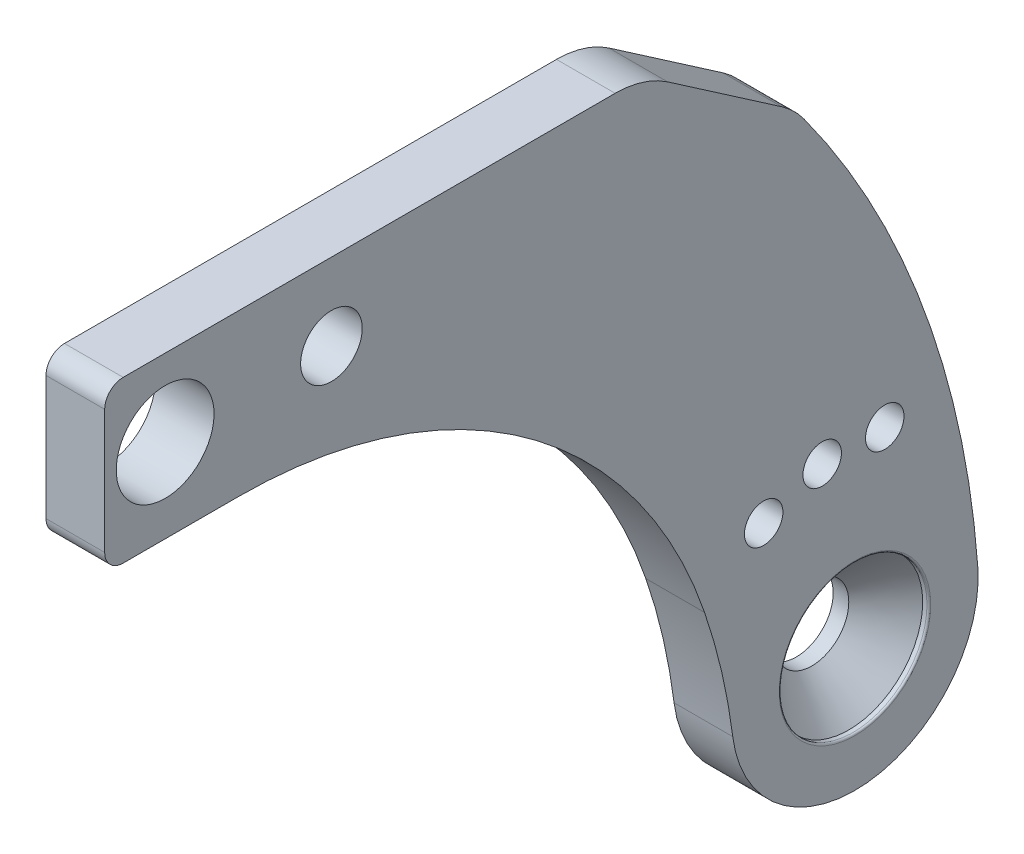
ISO-10303-21;
HEADER;
FILE_DESCRIPTION(('STEP AP214'),'2;1');
FILE_NAME('part.step','',(''),(''),'','','');
FILE_SCHEMA(('AUTOMOTIVE_DESIGN { 1 0 10303 214 1 1 1 1 }'));
ENDSEC;
DATA;
#1=APPLICATION_CONTEXT('core data for automotive mechanical design processes');
#2=APPLICATION_PROTOCOL_DEFINITION('international standard','automotive_design',2000,#1);
#3=PRODUCT_CONTEXT('',#1,'mechanical');
#4=PRODUCT('Part','Part','',(#3));
#5=PRODUCT_RELATED_PRODUCT_CATEGORY('part','',(#4));
#6=PRODUCT_DEFINITION_FORMATION('','',#4);
#7=PRODUCT_DEFINITION_CONTEXT('part definition',#1,'design');
#8=PRODUCT_DEFINITION('design','',#6,#7);
#9=PRODUCT_DEFINITION_SHAPE('','',#8);
#10=(LENGTH_UNIT() NAMED_UNIT(*) SI_UNIT(.MILLI.,.METRE.));
#11=(NAMED_UNIT(*) PLANE_ANGLE_UNIT() SI_UNIT($,.RADIAN.));
#12=(NAMED_UNIT(*) SI_UNIT($,.STERADIAN.) SOLID_ANGLE_UNIT());
#13=UNCERTAINTY_MEASURE_WITH_UNIT(LENGTH_MEASURE(1.E-05),#10,'distance_accuracy_value','');
#14=(GEOMETRIC_REPRESENTATION_CONTEXT(3) GLOBAL_UNCERTAINTY_ASSIGNED_CONTEXT((#13)) GLOBAL_UNIT_ASSIGNED_CONTEXT((#10,
#11,#12)) REPRESENTATION_CONTEXT('',''));
#15=CARTESIAN_POINT('',(0.,0.,0.));
#16=DIRECTION('',(0.,0.,1.));
#17=DIRECTION('',(1.,0.,0.));
#18=AXIS2_PLACEMENT_3D('',#15,#16,#17);
#19=CARTESIAN_POINT('',(4.765,-85.,-112.));
#20=DIRECTION('',(-1.,0.,0.));
#21=DIRECTION('',(0.,0.,1.));
#22=AXIS2_PLACEMENT_3D('',#19,#20,#21);
#23=CYLINDRICAL_SURFACE('',#22,6.);
#24=CARTESIAN_POINT('',(-4.765,-85.,-112.));
#25=DIRECTION('',(1.,0.,0.));
#26=DIRECTION('',(0.,0.,-1.));
#27=AXIS2_PLACEMENT_3D('',#24,#25,#26);
#28=CIRCLE('',#27,6.);
#29=CARTESIAN_POINT('',(-4.765,-85.,-118.));
#30=VERTEX_POINT('',#29);
#31=EDGE_CURVE('E154',#30,#30,#28,.T.);
#32=ORIENTED_EDGE('',*,*,#31,.F.);
#33=EDGE_LOOP('',(#32));
#34=FACE_BOUND('',#33,.T.);
#35=CARTESIAN_POINT('',(-2.23499999999997,-85.,-112.));
#36=DIRECTION('',(1.,0.,0.));
#37=DIRECTION('',(0.,0.,-1.));
#38=AXIS2_PLACEMENT_3D('',#35,#36,#37);
#39=CIRCLE('',#38,6.);
#40=CARTESIAN_POINT('',(-2.23499999999997,-85.,-118.));
#41=VERTEX_POINT('',#40);
#42=EDGE_CURVE('E170',#41,#41,#39,.T.);
#43=ORIENTED_EDGE('',*,*,#42,.T.);
#44=EDGE_LOOP('',(#43));
#45=FACE_BOUND('',#44,.T.);
#46=ADVANCED_FACE('F39',(#34,#45),#23,.F.);
#47=CARTESIAN_POINT('',(4.765,-85.,-112.));
#48=DIRECTION('',(-1.,0.,0.));
#49=DIRECTION('',(0.,0.,1.));
#50=AXIS2_PLACEMENT_3D('',#47,#48,#49);
#51=CYLINDRICAL_SURFACE('',#50,20.);
#52=CARTESIAN_POINT('',(-4.765,-85.,-112.));
#53=DIRECTION('',(1.,0.,0.));
#54=DIRECTION('',(0.,0.,-1.));
#55=AXIS2_PLACEMENT_3D('',#52,#53,#54);
#56=CIRCLE('',#55,20.);
#57=CARTESIAN_POINT('',(-4.765,-87.5158770823754,-92.158871944711));
#58=VERTEX_POINT('',#57);
#59=CARTESIAN_POINT('',(-4.765,-83.5261443022049,-131.94561980441));
#60=VERTEX_POINT('',#59);
#61=EDGE_CURVE('E158',#58,#60,#56,.T.);
#62=ORIENTED_EDGE('',*,*,#61,.T.);
#63=DIRECTION('',(-1.,0.,0.));
#64=VECTOR('',#63,1.);
#65=CARTESIAN_POINT('',(4.765,-83.5261443022049,-131.94561980441));
#66=LINE('',#65,#64);
#67=CARTESIAN_POINT('',(4.765,-83.5261443022049,-131.94561980441));
#68=VERTEX_POINT('',#67);
#69=EDGE_CURVE('E136',#68,#60,#66,.T.);
#70=ORIENTED_EDGE('',*,*,#69,.F.);
#71=CARTESIAN_POINT('',(4.765,-85.,-112.));
#72=DIRECTION('',(1.,0.,0.));
#73=DIRECTION('',(0.,0.,-1.));
#74=AXIS2_PLACEMENT_3D('',#71,#72,#73);
#75=CIRCLE('',#74,20.);
#76=CARTESIAN_POINT('',(4.765,-87.5158770823754,-92.158871944711));
#77=VERTEX_POINT('',#76);
#78=EDGE_CURVE('E143',#77,#68,#75,.T.);
#79=ORIENTED_EDGE('',*,*,#78,.F.);
#80=DIRECTION('',(-1.,0.,0.));
#81=VECTOR('',#80,1.);
#82=CARTESIAN_POINT('',(4.765,-87.5158770823754,-92.158871944711));
#83=LINE('',#82,#81);
#84=EDGE_CURVE('E236',#77,#58,#83,.T.);
#85=ORIENTED_EDGE('',*,*,#84,.T.);
#86=EDGE_LOOP('',(#62,#70,#79,#85));
#87=FACE_BOUND('',#86,.T.);
#88=ADVANCED_FACE('F156',(#87),#51,.T.);
#89=CARTESIAN_POINT('',(4.765,-94.5800620356681,17.6465287286657));
#90=DIRECTION('',(-1.,0.,0.));
#91=DIRECTION('',(0.,0.,1.));
#92=AXIS2_PLACEMENT_3D('',#89,#90,#91);
#93=CYLINDRICAL_SURFACE('',#92,150.);
#94=CARTESIAN_POINT('',(-4.765,-94.5800620356681,17.6465287286657));
#95=DIRECTION('',(1.,0.,0.));
#96=DIRECTION('',(0.,0.,-1.));
#97=AXIS2_PLACEMENT_3D('',#94,#95,#96);
#98=CIRCLE('',#97,150.);
#99=CARTESIAN_POINT('',(-4.765,-6.44798641080063,-103.731958846574));
#100=VERTEX_POINT('',#99);
#101=EDGE_CURVE('E238',#60,#100,#98,.T.);
#102=ORIENTED_EDGE('',*,*,#101,.T.);
#103=DIRECTION('',(-1.,0.,0.));
#104=VECTOR('',#103,1.);
#105=CARTESIAN_POINT('',(4.765,-6.44798641080062,-103.731958846574));
#106=LINE('',#105,#104);
#107=CARTESIAN_POINT('',(4.765,-6.44798641080063,-103.731958846574));
#108=VERTEX_POINT('',#107);
#109=EDGE_CURVE('E139',#100,#108,#106,.F.);
#110=ORIENTED_EDGE('',*,*,#109,.T.);
#111=CARTESIAN_POINT('',(4.765,-94.5800620356681,17.6465287286657));
#112=DIRECTION('',(1.,0.,0.));
#113=DIRECTION('',(0.,0.,-1.));
#114=AXIS2_PLACEMENT_3D('',#111,#112,#113);
#115=CIRCLE('',#114,150.);
#116=EDGE_CURVE('E131',#68,#108,#115,.T.);
#117=ORIENTED_EDGE('',*,*,#116,.F.);
#118=ORIENTED_EDGE('',*,*,#69,.T.);
#119=EDGE_LOOP('',(#102,#110,#117,#118));
#120=FACE_BOUND('',#119,.T.);
#121=ADVANCED_FACE('F134',(#120),#93,.T.);
#122=CARTESIAN_POINT('',(4.765,44.790257494992,-30.8491384775337));
#123=DIRECTION('',(0.,-0.823562335253105,0.56722577511292));
#124=DIRECTION('',(0.,-0.56722577511292,-0.823562335253105));
#125=AXIS2_PLACEMENT_3D('',#122,#123,#124);
#126=PLANE('',#125);
#127=DIRECTION('',(0.,0.56722577511292,0.823562335253105));
#128=VECTOR('',#127,1.);
#129=CARTESIAN_POINT('',(4.765,44.790257494992,-30.8491384775337));
#130=LINE('',#129,#128);
#131=CARTESIAN_POINT('',(4.765,-2.90775894449084,-100.102496715744));
#132=VERTEX_POINT('',#131);
#133=CARTESIAN_POINT('',(4.765,9.85343502879504,-81.574356475352));
#134=VERTEX_POINT('',#133);
#135=EDGE_CURVE('E142',#132,#134,#130,.T.);
#136=ORIENTED_EDGE('',*,*,#135,.F.);
#137=DIRECTION('',(-1.,0.,0.));
#138=VECTOR('',#137,1.);
#139=CARTESIAN_POINT('',(4.765,-2.90775894449084,-100.102496715744));
#140=LINE('',#139,#138);
#141=CARTESIAN_POINT('',(-4.765,-2.90775894449084,-100.102496715744));
#142=VERTEX_POINT('',#141);
#143=EDGE_CURVE('E187',#132,#142,#140,.T.);
#144=ORIENTED_EDGE('',*,*,#143,.T.);
#145=DIRECTION('',(0.,0.56722577511292,0.823562335253105));
#146=VECTOR('',#145,1.);
#147=CARTESIAN_POINT('',(-4.765,44.790257494992,-30.8491384775337));
#148=LINE('',#147,#146);
#149=CARTESIAN_POINT('',(-4.765,9.85343502879504,-81.574356475352));
#150=VERTEX_POINT('',#149);
#151=EDGE_CURVE('E240',#142,#150,#148,.T.);
#152=ORIENTED_EDGE('',*,*,#151,.T.);
#153=DIRECTION('',(-1.,0.,0.));
#154=VECTOR('',#153,1.);
#155=CARTESIAN_POINT('',(4.765,9.85343502879504,-81.574356475352));
#156=LINE('',#155,#154);
#157=EDGE_CURVE('E160',#134,#150,#156,.T.);
#158=ORIENTED_EDGE('',*,*,#157,.F.);
#159=EDGE_LOOP('',(#136,#144,#152,#158));
#160=FACE_BOUND('',#159,.T.);
#161=ADVANCED_FACE('F268',(#160),#126,.F.);
#162=CARTESIAN_POINT('',(4.765,-2.5000000000015,-73.0659698486582));
#163=DIRECTION('',(-1.,0.,0.));
#164=DIRECTION('',(0.,0.,1.));
#165=AXIS2_PLACEMENT_3D('',#162,#163,#164);
#166=CYLINDRICAL_SURFACE('',#165,15.);
#167=CARTESIAN_POINT('',(-4.765,-2.5000000000015,-73.0659698486582));
#168=DIRECTION('',(1.,0.,0.));
#169=DIRECTION('',(0.,0.,-1.));
#170=AXIS2_PLACEMENT_3D('',#167,#168,#169);
#171=CIRCLE('',#170,15.);
#172=CARTESIAN_POINT('',(-4.765,12.4999999999985,-73.0659698486582));
#173=VERTEX_POINT('',#172);
#174=EDGE_CURVE('E242',#150,#173,#171,.T.);
#175=ORIENTED_EDGE('',*,*,#174,.T.);
#176=DIRECTION('',(-1.,0.,0.));
#177=VECTOR('',#176,1.);
#178=CARTESIAN_POINT('',(4.765,12.4999999999985,-73.0659698486582));
#179=LINE('',#178,#177);
#180=CARTESIAN_POINT('',(4.765,12.4999999999985,-73.0659698486582));
#181=VERTEX_POINT('',#180);
#182=EDGE_CURVE('E166',#181,#173,#179,.T.);
#183=ORIENTED_EDGE('',*,*,#182,.F.);
#184=CARTESIAN_POINT('',(4.765,-2.5000000000015,-73.0659698486582));
#185=DIRECTION('',(1.,0.,0.));
#186=DIRECTION('',(0.,0.,-1.));
#187=AXIS2_PLACEMENT_3D('',#184,#185,#186);
#188=CIRCLE('',#187,15.);
#189=EDGE_CURVE('E230',#134,#181,#188,.T.);
#190=ORIENTED_EDGE('',*,*,#189,.F.);
#191=ORIENTED_EDGE('',*,*,#157,.T.);
#192=EDGE_LOOP('',(#175,#183,#190,#191));
#193=FACE_BOUND('',#192,.T.);
#194=ADVANCED_FACE('F264',(#193),#166,.T.);
#195=CARTESIAN_POINT('',(4.765,12.4999999999985,0.));
#196=DIRECTION('',(0.,-1.,0.));
#197=DIRECTION('',(0.,0.,-1.));
#198=AXIS2_PLACEMENT_3D('',#195,#196,#197);
#199=PLANE('',#198);
#200=DIRECTION('',(0.,0.,1.));
#201=VECTOR('',#200,1.);
#202=CARTESIAN_POINT('',(-4.765,12.4999999999985,0.));
#203=LINE('',#202,#201);
#204=CARTESIAN_POINT('',(-4.765,12.4999999999985,6.81645687003658));
#205=VERTEX_POINT('',#204);
#206=EDGE_CURVE('E244',#173,#205,#203,.T.);
#207=ORIENTED_EDGE('',*,*,#206,.T.);
#208=DIRECTION('',(1.,0.,0.));
#209=VECTOR('',#208,1.);
#210=CARTESIAN_POINT('',(4.765,12.4999999999985,6.81645687003658));
#211=LINE('',#210,#209);
#212=CARTESIAN_POINT('',(4.765,12.4999999999985,6.81645687003658));
#213=VERTEX_POINT('',#212);
#214=EDGE_CURVE('E11',#205,#213,#211,.T.);
#215=ORIENTED_EDGE('',*,*,#214,.T.);
#216=DIRECTION('',(0.,0.,1.));
#217=VECTOR('',#216,1.);
#218=CARTESIAN_POINT('',(4.765,12.4999999999985,0.));
#219=LINE('',#218,#217);
#220=EDGE_CURVE('E225',#181,#213,#219,.T.);
#221=ORIENTED_EDGE('',*,*,#220,.F.);
#222=ORIENTED_EDGE('',*,*,#182,.T.);
#223=EDGE_LOOP('',(#207,#215,#221,#222));
#224=FACE_BOUND('',#223,.T.);
#225=ADVANCED_FACE('F258',(#224),#199,.F.);
#226=CARTESIAN_POINT('',(4.765,-13.626101457147,0.));
#227=DIRECTION('',(0.,1.,0.));
#228=DIRECTION('',(0.,0.,1.));
#229=AXIS2_PLACEMENT_3D('',#226,#227,#228);
#230=PLANE('',#229);
#231=DIRECTION('',(0.,0.,-1.));
#232=VECTOR('',#231,1.);
#233=CARTESIAN_POINT('',(4.765,-13.626101457147,0.));
#234=LINE('',#233,#232);
#235=CARTESIAN_POINT('',(4.765,-13.626101457147,6.81645687003658));
#236=VERTEX_POINT('',#235);
#237=CARTESIAN_POINT('',(4.765,-13.626101457147,-11.8780818783994));
#238=VERTEX_POINT('',#237);
#239=EDGE_CURVE('E221',#236,#238,#234,.T.);
#240=ORIENTED_EDGE('',*,*,#239,.F.);
#241=DIRECTION('',(1.,0.,0.));
#242=VECTOR('',#241,1.);
#243=CARTESIAN_POINT('',(4.765,-13.626101457147,6.81645687003658));
#244=LINE('',#243,#242);
#245=CARTESIAN_POINT('',(-4.765,-13.626101457147,6.81645687003658));
#246=VERTEX_POINT('',#245);
#247=EDGE_CURVE('E62',#236,#246,#244,.F.);
#248=ORIENTED_EDGE('',*,*,#247,.T.);
#249=DIRECTION('',(0.,0.,-1.));
#250=VECTOR('',#249,1.);
#251=CARTESIAN_POINT('',(-4.765,-13.626101457147,0.));
#252=LINE('',#251,#250);
#253=CARTESIAN_POINT('',(-4.765,-13.626101457147,-11.8780818783994));
#254=VERTEX_POINT('',#253);
#255=EDGE_CURVE('E210',#246,#254,#252,.T.);
#256=ORIENTED_EDGE('',*,*,#255,.T.);
#257=DIRECTION('',(1.,0.,0.));
#258=VECTOR('',#257,1.);
#259=CARTESIAN_POINT('',(4.765,-13.626101457147,-11.8780818783994));
#260=LINE('',#259,#258);
#261=EDGE_CURVE('E179',#254,#238,#260,.T.);
#262=ORIENTED_EDGE('',*,*,#261,.T.);
#263=EDGE_LOOP('',(#240,#248,#256,#262));
#264=FACE_BOUND('',#263,.T.);
#265=ADVANCED_FACE('F222',(#264),#230,.F.);
#266=CARTESIAN_POINT('',(4.765,-1.94289029309402E-13,-27.));
#267=DIRECTION('',(-1.,0.,0.));
#268=DIRECTION('',(0.,0.,1.));
#269=AXIS2_PLACEMENT_3D('',#266,#267,#268);
#270=CYLINDRICAL_SURFACE('',#269,4.99999999999999);
#271=CARTESIAN_POINT('',(4.765,-1.94289029309402E-13,-27.));
#272=DIRECTION('',(1.,0.,0.));
#273=DIRECTION('',(0.,0.,-1.));
#274=AXIS2_PLACEMENT_3D('',#271,#272,#273);
#275=CIRCLE('',#274,4.99999999999999);
#276=CARTESIAN_POINT('',(4.765,-1.94289029309402E-13,-32.));
#277=VERTEX_POINT('',#276);
#278=EDGE_CURVE('E227',#277,#277,#275,.T.);
#279=ORIENTED_EDGE('',*,*,#278,.T.);
#280=EDGE_LOOP('',(#279));
#281=FACE_BOUND('',#280,.T.);
#282=CARTESIAN_POINT('',(-4.765,-1.94289029309402E-13,-27.));
#283=DIRECTION('',(1.,0.,0.));
#284=DIRECTION('',(0.,0.,-1.));
#285=AXIS2_PLACEMENT_3D('',#282,#283,#284);
#286=CIRCLE('',#285,4.99999999999999);
#287=CARTESIAN_POINT('',(-4.765,-1.94289029309402E-13,-32.));
#288=VERTEX_POINT('',#287);
#289=EDGE_CURVE('E249',#288,#288,#286,.T.);
#290=ORIENTED_EDGE('',*,*,#289,.F.);
#291=EDGE_LOOP('',(#290));
#292=FACE_BOUND('',#291,.T.);
#293=ADVANCED_FACE('F302',(#281,#292),#270,.F.);
#294=CARTESIAN_POINT('',(4.765,-100.095262494252,7.04676833173432));
#295=DIRECTION('',(-1.,0.,0.));
#296=DIRECTION('',(0.,0.,1.));
#297=AXIS2_PLACEMENT_3D('',#294,#295,#296);
#298=CYLINDRICAL_SURFACE('',#297,100.);
#299=CARTESIAN_POINT('',(4.765,-100.095262494252,7.04676833173432));
#300=DIRECTION('',(1.,0.,0.));
#301=DIRECTION('',(0.,0.,-1.));
#302=AXIS2_PLACEMENT_3D('',#299,#300,#301);
#303=CIRCLE('',#302,100.);
#304=CARTESIAN_POINT('',(4.765,-67.7494573087261,-87.5774827189344));
#305=VERTEX_POINT('',#304);
#306=EDGE_CURVE('E150',#305,#77,#303,.F.);
#307=ORIENTED_EDGE('',*,*,#306,.F.);
#308=DIRECTION('',(-1.,0.,0.));
#309=VECTOR('',#308,1.);
#310=CARTESIAN_POINT('',(4.765,-67.7494573087261,-87.5774827189344));
#311=LINE('',#310,#309);
#312=CARTESIAN_POINT('',(-4.765,-67.7494573087261,-87.5774827189344));
#313=VERTEX_POINT('',#312);
#314=EDGE_CURVE('E176',#305,#313,#311,.T.);
#315=ORIENTED_EDGE('',*,*,#314,.T.);
#316=CARTESIAN_POINT('',(-4.765,-100.095262494252,7.04676833173432));
#317=DIRECTION('',(1.,0.,0.));
#318=DIRECTION('',(0.,0.,-1.));
#319=AXIS2_PLACEMENT_3D('',#316,#317,#318);
#320=CIRCLE('',#319,100.);
#321=EDGE_CURVE('E247',#313,#58,#320,.F.);
#322=ORIENTED_EDGE('',*,*,#321,.T.);
#323=ORIENTED_EDGE('',*,*,#84,.F.);
#324=EDGE_LOOP('',(#307,#315,#322,#323));
#325=FACE_BOUND('',#324,.T.);
#326=ADVANCED_FACE('F274',(#325),#298,.F.);
#327=CARTESIAN_POINT('',(4.765,0.,0.));
#328=DIRECTION('',(1.,0.,0.));
#329=DIRECTION('',(0.,0.,-1.));
#330=AXIS2_PLACEMENT_3D('',#327,#328,#329);
#331=PLANE('',#330);
#332=CARTESIAN_POINT('',(4.765,0.,0.));
#333=DIRECTION('',(1.,0.,0.));
#334=DIRECTION('',(0.,0.,-1.));
#335=AXIS2_PLACEMENT_3D('',#332,#333,#334);
#336=CIRCLE('',#335,7.94);
#337=CARTESIAN_POINT('',(4.765,0.,-7.94));
#338=VERTEX_POINT('',#337);
#339=EDGE_CURVE('E438',#338,#338,#336,.T.);
#340=ORIENTED_EDGE('',*,*,#339,.F.);
#341=EDGE_LOOP('',(#340));
#342=FACE_BOUND('',#341,.T.);
#343=DIRECTION('',(0.,1.,0.));
#344=VECTOR('',#343,1.);
#345=CARTESIAN_POINT('',(4.765,12.4999999999985,9.81645687003658));
#346=LINE('',#345,#344);
#347=CARTESIAN_POINT('',(4.765,-10.626101457147,9.81645687003658));
#348=VERTEX_POINT('',#347);
#349=CARTESIAN_POINT('',(4.765,9.49999999999848,9.81645687003658));
#350=VERTEX_POINT('',#349);
#351=EDGE_CURVE('E218',#348,#350,#346,.T.);
#352=ORIENTED_EDGE('',*,*,#351,.F.);
#353=CARTESIAN_POINT('',(4.765,-10.626101457147,6.81645687003658));
#354=DIRECTION('',(1.,0.,0.));
#355=DIRECTION('',(0.,0.,-1.));
#356=AXIS2_PLACEMENT_3D('',#353,#354,#355);
#357=CIRCLE('',#356,3.);
#358=EDGE_CURVE('E202',#348,#236,#357,.T.);
#359=ORIENTED_EDGE('',*,*,#358,.T.);
#360=ORIENTED_EDGE('',*,*,#239,.T.);
#361=CARTESIAN_POINT('',(4.765,-93.626101457147,-11.8780818783994));
#362=DIRECTION('',(1.,0.,0.));
#363=DIRECTION('',(0.,0.,-1.));
#364=AXIS2_PLACEMENT_3D('',#361,#362,#363);
#365=CIRCLE('',#364,80.);
#366=EDGE_CURVE('E185',#238,#305,#365,.F.);
#367=ORIENTED_EDGE('',*,*,#366,.T.);
#368=ORIENTED_EDGE('',*,*,#306,.T.);
#369=ORIENTED_EDGE('',*,*,#78,.T.);
#370=ORIENTED_EDGE('',*,*,#116,.T.);
#371=CARTESIAN_POINT('',(4.765,-15.2611939732874,-91.5941100890501));
#372=DIRECTION('',(1.,0.,0.));
#373=DIRECTION('',(0.,0.,-1.));
#374=AXIS2_PLACEMENT_3D('',#371,#372,#373);
#375=CIRCLE('',#374,15.);
#376=EDGE_CURVE('E193',#108,#132,#375,.T.);
#377=ORIENTED_EDGE('',*,*,#376,.T.);
#378=ORIENTED_EDGE('',*,*,#135,.T.);
#379=ORIENTED_EDGE('',*,*,#189,.T.);
#380=ORIENTED_EDGE('',*,*,#220,.T.);
#381=CARTESIAN_POINT('',(4.765,9.49999999999848,6.81645687003658));
#382=DIRECTION('',(1.,0.,0.));
#383=DIRECTION('',(0.,0.,-1.));
#384=AXIS2_PLACEMENT_3D('',#381,#382,#383);
#385=CIRCLE('',#384,3.);
#386=EDGE_CURVE('E200',#213,#350,#385,.T.);
#387=ORIENTED_EDGE('',*,*,#386,.T.);
#388=EDGE_LOOP('',(#352,#359,#360,#367,#368,#369,#370,#377,#378,#379,#380,#387));
#389=FACE_BOUND('',#388,.T.);
#390=CARTESIAN_POINT('',(4.765,-60.,-97.1752158531735));
#391=DIRECTION('',(1.,0.,0.));
#392=DIRECTION('',(0.,0.,-1.));
#393=AXIS2_PLACEMENT_3D('',#390,#391,#392);
#394=CIRCLE('',#393,3.125);
#395=CARTESIAN_POINT('',(4.765,-60.,-100.300215853173));
#396=VERTEX_POINT('',#395);
#397=EDGE_CURVE('E446',#396,#396,#394,.F.);
#398=ORIENTED_EDGE('',*,*,#397,.T.);
#399=EDGE_LOOP('',(#398));
#400=FACE_BOUND('',#399,.T.);
#401=CARTESIAN_POINT('',(4.765,-56.3404058236579,-116.837549653221));
#402=DIRECTION('',(1.,0.,0.));
#403=DIRECTION('',(0.,0.,-1.));
#404=AXIS2_PLACEMENT_3D('',#401,#402,#403);
#405=CIRCLE('',#404,3.125);
#406=CARTESIAN_POINT('',(4.765,-56.3404058236579,-119.962549653221));
#407=VERTEX_POINT('',#406);
#408=EDGE_CURVE('E452',#407,#407,#405,.F.);
#409=ORIENTED_EDGE('',*,*,#408,.T.);
#410=EDGE_LOOP('',(#409));
#411=FACE_BOUND('',#410,.T.);
#412=CARTESIAN_POINT('',(4.765,-56.4257134050813,-106.681694763231));
#413=DIRECTION('',(1.,0.,0.));
#414=DIRECTION('',(0.,0.,-1.));
#415=AXIS2_PLACEMENT_3D('',#412,#413,#414);
#416=CIRCLE('',#415,3.125);
#417=CARTESIAN_POINT('',(4.765,-56.4257134050813,-109.806694763231));
#418=VERTEX_POINT('',#417);
#419=EDGE_CURVE('E217',#418,#418,#416,.F.);
#420=ORIENTED_EDGE('',*,*,#419,.T.);
#421=EDGE_LOOP('',(#420));
#422=FACE_BOUND('',#421,.T.);
#423=CARTESIAN_POINT('',(4.765,-85.,-112.));
#424=DIRECTION('',(1.,0.,0.));
#425=DIRECTION('',(0.,0.,-1.));
#426=AXIS2_PLACEMENT_3D('',#423,#424,#425);
#427=CIRCLE('',#426,12.3);
#428=CARTESIAN_POINT('',(4.765,-85.,-124.3));
#429=VERTEX_POINT('',#428);
#430=EDGE_CURVE('E163',#429,#429,#427,.F.);
#431=ORIENTED_EDGE('',*,*,#430,.T.);
#432=EDGE_LOOP('',(#431));
#433=FACE_BOUND('',#432,.T.);
#434=ORIENTED_EDGE('',*,*,#278,.F.);
#435=EDGE_LOOP('',(#434));
#436=FACE_BOUND('',#435,.T.);
#437=ADVANCED_FACE('F147',(#342,#389,#400,#411,#422,#433,#436),#331,.T.);
#438=CARTESIAN_POINT('',(-4.765,0.,0.));
#439=DIRECTION('',(1.,0.,0.));
#440=DIRECTION('',(0.,0.,-1.));
#441=AXIS2_PLACEMENT_3D('',#438,#439,#440);
#442=PLANE('',#441);
#443=CARTESIAN_POINT('',(-4.765,0.,0.));
#444=DIRECTION('',(1.,0.,0.));
#445=DIRECTION('',(0.,0.,-1.));
#446=AXIS2_PLACEMENT_3D('',#443,#444,#445);
#447=CIRCLE('',#446,7.94);
#448=CARTESIAN_POINT('',(-4.765,0.,-7.94));
#449=VERTEX_POINT('',#448);
#450=EDGE_CURVE('E435',#449,#449,#447,.T.);
#451=ORIENTED_EDGE('',*,*,#450,.T.);
#452=EDGE_LOOP('',(#451));
#453=FACE_BOUND('',#452,.T.);
#454=CARTESIAN_POINT('',(-4.765,-60.,-97.1752158531735));
#455=DIRECTION('',(-1.,0.,0.));
#456=DIRECTION('',(0.,0.,1.));
#457=AXIS2_PLACEMENT_3D('',#454,#455,#456);
#458=CIRCLE('',#457,3.125);
#459=CARTESIAN_POINT('',(-4.765,-60.,-94.0502158531735));
#460=VERTEX_POINT('',#459);
#461=EDGE_CURVE('E443',#460,#460,#458,.T.);
#462=ORIENTED_EDGE('',*,*,#461,.F.);
#463=EDGE_LOOP('',(#462));
#464=FACE_BOUND('',#463,.T.);
#465=CARTESIAN_POINT('',(-4.765,-56.3404058236579,-116.837549653221));
#466=DIRECTION('',(-1.,0.,0.));
#467=DIRECTION('',(0.,0.,1.));
#468=AXIS2_PLACEMENT_3D('',#465,#466,#467);
#469=CIRCLE('',#468,3.125);
#470=CARTESIAN_POINT('',(-4.765,-56.3404058236579,-113.712549653221));
#471=VERTEX_POINT('',#470);
#472=EDGE_CURVE('E449',#471,#471,#469,.T.);
#473=ORIENTED_EDGE('',*,*,#472,.F.);
#474=EDGE_LOOP('',(#473));
#475=FACE_BOUND('',#474,.T.);
#476=CARTESIAN_POINT('',(-4.765,-56.4257134050813,-106.681694763231));
#477=DIRECTION('',(-1.,0.,0.));
#478=DIRECTION('',(0.,0.,1.));
#479=AXIS2_PLACEMENT_3D('',#476,#477,#478);
#480=CIRCLE('',#479,3.125);
#481=CARTESIAN_POINT('',(-4.765,-56.4257134050813,-103.556694763231));
#482=VERTEX_POINT('',#481);
#483=EDGE_CURVE('E455',#482,#482,#480,.T.);
#484=ORIENTED_EDGE('',*,*,#483,.F.);
#485=EDGE_LOOP('',(#484));
#486=FACE_BOUND('',#485,.T.);
#487=ORIENTED_EDGE('',*,*,#255,.F.);
#488=CARTESIAN_POINT('',(-4.765,-10.626101457147,6.81645687003658));
#489=DIRECTION('',(1.,0.,0.));
#490=DIRECTION('',(0.,0.,-1.));
#491=AXIS2_PLACEMENT_3D('',#488,#489,#490);
#492=CIRCLE('',#491,3.);
#493=CARTESIAN_POINT('',(-4.765,-10.626101457147,9.81645687003658));
#494=VERTEX_POINT('',#493);
#495=EDGE_CURVE('E47',#246,#494,#492,.F.);
#496=ORIENTED_EDGE('',*,*,#495,.T.);
#497=DIRECTION('',(0.,1.,0.));
#498=VECTOR('',#497,1.);
#499=CARTESIAN_POINT('',(-4.765,12.4999999999985,9.81645687003658));
#500=LINE('',#499,#498);
#501=CARTESIAN_POINT('',(-4.765,9.49999999999848,9.81645687003658));
#502=VERTEX_POINT('',#501);
#503=EDGE_CURVE('E209',#494,#502,#500,.T.);
#504=ORIENTED_EDGE('',*,*,#503,.T.);
#505=CARTESIAN_POINT('',(-4.765,9.49999999999848,6.81645687003658));
#506=DIRECTION('',(1.,0.,0.));
#507=DIRECTION('',(0.,0.,-1.));
#508=AXIS2_PLACEMENT_3D('',#505,#506,#507);
#509=CIRCLE('',#508,3.);
#510=EDGE_CURVE('E54',#502,#205,#509,.F.);
#511=ORIENTED_EDGE('',*,*,#510,.T.);
#512=ORIENTED_EDGE('',*,*,#206,.F.);
#513=ORIENTED_EDGE('',*,*,#174,.F.);
#514=ORIENTED_EDGE('',*,*,#151,.F.);
#515=CARTESIAN_POINT('',(-4.765,-15.2611939732874,-91.5941100890501));
#516=DIRECTION('',(1.,0.,0.));
#517=DIRECTION('',(0.,0.,-1.));
#518=AXIS2_PLACEMENT_3D('',#515,#516,#517);
#519=CIRCLE('',#518,15.);
#520=EDGE_CURVE('E190',#142,#100,#519,.F.);
#521=ORIENTED_EDGE('',*,*,#520,.T.);
#522=ORIENTED_EDGE('',*,*,#101,.F.);
#523=ORIENTED_EDGE('',*,*,#61,.F.);
#524=ORIENTED_EDGE('',*,*,#321,.F.);
#525=CARTESIAN_POINT('',(-4.765,-93.626101457147,-11.8780818783994));
#526=DIRECTION('',(1.,0.,0.));
#527=DIRECTION('',(0.,0.,-1.));
#528=AXIS2_PLACEMENT_3D('',#525,#526,#527);
#529=CIRCLE('',#528,80.);
#530=EDGE_CURVE('E182',#313,#254,#529,.T.);
#531=ORIENTED_EDGE('',*,*,#530,.T.);
#532=EDGE_LOOP('',(#487,#496,#504,#511,#512,#513,#514,#521,#522,#523,#524,#531));
#533=FACE_BOUND('',#532,.T.);
#534=ORIENTED_EDGE('',*,*,#289,.T.);
#535=EDGE_LOOP('',(#534));
#536=FACE_BOUND('',#535,.T.);
#537=ORIENTED_EDGE('',*,*,#31,.T.);
#538=EDGE_LOOP('',(#537));
#539=FACE_BOUND('',#538,.T.);
#540=ADVANCED_FACE('F207',(#453,#464,#475,#486,#533,#536,#539),#442,.F.);
#541=CARTESIAN_POINT('',(4.765,-85.,-112.));
#542=DIRECTION('',(1.,0.,0.));
#543=DIRECTION('',(0.,0.,-1.));
#544=AXIS2_PLACEMENT_3D('',#541,#542,#543);
#545=CYLINDRICAL_SURFACE('',#544,12.);
#546=CARTESIAN_POINT('',(4.465,-85.,-112.));
#547=DIRECTION('',(1.,0.,0.));
#548=DIRECTION('',(0.,0.,-1.));
#549=AXIS2_PLACEMENT_3D('',#546,#547,#548);
#550=CIRCLE('',#549,12.);
#551=CARTESIAN_POINT('',(4.465,-85.,-124.));
#552=VERTEX_POINT('',#551);
#553=EDGE_CURVE('E159',#552,#552,#550,.T.);
#554=ORIENTED_EDGE('',*,*,#553,.T.);
#555=EDGE_LOOP('',(#554));
#556=FACE_BOUND('',#555,.T.);
#557=CARTESIAN_POINT('',(3.765,-85.,-112.));
#558=DIRECTION('',(1.,0.,0.));
#559=DIRECTION('',(0.,0.,-1.));
#560=AXIS2_PLACEMENT_3D('',#557,#558,#559);
#561=CIRCLE('',#560,12.);
#562=CARTESIAN_POINT('',(3.765,-85.,-124.));
#563=VERTEX_POINT('',#562);
#564=EDGE_CURVE('E172',#563,#563,#561,.T.);
#565=ORIENTED_EDGE('',*,*,#564,.F.);
#566=EDGE_LOOP('',(#565));
#567=FACE_BOUND('',#566,.T.);
#568=ADVANCED_FACE('F357',(#556,#567),#545,.F.);
#569=CARTESIAN_POINT('',(-2.24499999999998,-85.,-112.));
#570=DIRECTION('',(1.,0.,0.));
#571=DIRECTION('',(0.,0.,-1.));
#572=AXIS2_PLACEMENT_3D('',#569,#570,#571);
#573=CONICAL_SURFACE('',#572,5.98999999999999,0.78539816339745);
#574=ORIENTED_EDGE('',*,*,#42,.F.);
#575=EDGE_LOOP('',(#574));
#576=FACE_BOUND('',#575,.T.);
#577=ORIENTED_EDGE('',*,*,#564,.T.);
#578=EDGE_LOOP('',(#577));
#579=FACE_BOUND('',#578,.T.);
#580=ADVANCED_FACE('F287',(#576,#579),#573,.F.);
#581=CARTESIAN_POINT('',(4.465,-85.,-112.));
#582=DIRECTION('',(1.,0.,0.));
#583=DIRECTION('',(0.,0.,-1.));
#584=AXIS2_PLACEMENT_3D('',#581,#582,#583);
#585=TOROIDAL_SURFACE('',#584,12.3,0.3);
#586=ORIENTED_EDGE('',*,*,#430,.F.);
#587=EDGE_LOOP('',(#586));
#588=FACE_BOUND('',#587,.T.);
#589=ORIENTED_EDGE('',*,*,#553,.F.);
#590=EDGE_LOOP('',(#589));
#591=FACE_BOUND('',#590,.T.);
#592=ADVANCED_FACE('F279',(#588,#591),#585,.T.);
#593=CARTESIAN_POINT('',(4.765,-93.626101457147,-11.8780818783994));
#594=DIRECTION('',(-1.,0.,0.));
#595=DIRECTION('',(0.,0.,1.));
#596=AXIS2_PLACEMENT_3D('',#593,#594,#595);
#597=CYLINDRICAL_SURFACE('',#596,80.);
#598=ORIENTED_EDGE('',*,*,#366,.F.);
#599=ORIENTED_EDGE('',*,*,#261,.F.);
#600=ORIENTED_EDGE('',*,*,#530,.F.);
#601=ORIENTED_EDGE('',*,*,#314,.F.);
#602=EDGE_LOOP('',(#598,#599,#600,#601));
#603=FACE_BOUND('',#602,.T.);
#604=ADVANCED_FACE('F277',(#603),#597,.F.);
#605=CARTESIAN_POINT('',(4.765,-15.2611939732874,-91.5941100890501));
#606=DIRECTION('',(-1.,0.,0.));
#607=DIRECTION('',(0.,0.,1.));
#608=AXIS2_PLACEMENT_3D('',#605,#606,#607);
#609=CYLINDRICAL_SURFACE('',#608,15.);
#610=ORIENTED_EDGE('',*,*,#376,.F.);
#611=ORIENTED_EDGE('',*,*,#109,.F.);
#612=ORIENTED_EDGE('',*,*,#520,.F.);
#613=ORIENTED_EDGE('',*,*,#143,.F.);
#614=EDGE_LOOP('',(#610,#611,#612,#613));
#615=FACE_BOUND('',#614,.T.);
#616=ADVANCED_FACE('F271',(#615),#609,.T.);
#617=CARTESIAN_POINT('',(4.766,-56.4257134050813,-106.681694763231));
#618=DIRECTION('',(-1.,0.,0.));
#619=DIRECTION('',(0.,0.,1.));
#620=AXIS2_PLACEMENT_3D('',#617,#618,#619);
#621=CYLINDRICAL_SURFACE('',#620,3.125);
#622=ORIENTED_EDGE('',*,*,#419,.F.);
#623=EDGE_LOOP('',(#622));
#624=FACE_BOUND('',#623,.T.);
#625=ORIENTED_EDGE('',*,*,#483,.T.);
#626=EDGE_LOOP('',(#625));
#627=FACE_BOUND('',#626,.T.);
#628=ADVANCED_FACE('F285',(#624,#627),#621,.F.);
#629=CARTESIAN_POINT('',(4.766,-56.3404058236579,-116.837549653221));
#630=DIRECTION('',(-1.,0.,0.));
#631=DIRECTION('',(0.,0.,1.));
#632=AXIS2_PLACEMENT_3D('',#629,#630,#631);
#633=CYLINDRICAL_SURFACE('',#632,3.125);
#634=ORIENTED_EDGE('',*,*,#408,.F.);
#635=EDGE_LOOP('',(#634));
#636=FACE_BOUND('',#635,.T.);
#637=ORIENTED_EDGE('',*,*,#472,.T.);
#638=EDGE_LOOP('',(#637));
#639=FACE_BOUND('',#638,.T.);
#640=ADVANCED_FACE('F389',(#636,#639),#633,.F.);
#641=CARTESIAN_POINT('',(4.766,-60.,-97.1752158531735));
#642=DIRECTION('',(-1.,0.,0.));
#643=DIRECTION('',(0.,0.,1.));
#644=AXIS2_PLACEMENT_3D('',#641,#642,#643);
#645=CYLINDRICAL_SURFACE('',#644,3.125);
#646=ORIENTED_EDGE('',*,*,#397,.F.);
#647=EDGE_LOOP('',(#646));
#648=FACE_BOUND('',#647,.T.);
#649=ORIENTED_EDGE('',*,*,#461,.T.);
#650=EDGE_LOOP('',(#649));
#651=FACE_BOUND('',#650,.T.);
#652=ADVANCED_FACE('F397',(#648,#651),#645,.F.);
#653=CARTESIAN_POINT('',(-4.765,12.4999999999985,9.81645687003658));
#654=DIRECTION('',(0.,0.,-1.));
#655=DIRECTION('',(0.,1.,0.));
#656=AXIS2_PLACEMENT_3D('',#653,#654,#655);
#657=PLANE('',#656);
#658=ORIENTED_EDGE('',*,*,#503,.F.);
#659=DIRECTION('',(1.,0.,0.));
#660=VECTOR('',#659,1.);
#661=CARTESIAN_POINT('',(-4.765,-10.626101457147,9.81645687003658));
#662=LINE('',#661,#660);
#663=EDGE_CURVE('E197',#494,#348,#662,.T.);
#664=ORIENTED_EDGE('',*,*,#663,.T.);
#665=ORIENTED_EDGE('',*,*,#351,.T.);
#666=DIRECTION('',(1.,0.,0.));
#667=VECTOR('',#666,1.);
#668=CARTESIAN_POINT('',(-4.765,9.49999999999848,9.81645687003658));
#669=LINE('',#668,#667);
#670=EDGE_CURVE('E195',#350,#502,#669,.F.);
#671=ORIENTED_EDGE('',*,*,#670,.T.);
#672=EDGE_LOOP('',(#658,#664,#665,#671));
#673=FACE_BOUND('',#672,.T.);
#674=ADVANCED_FACE('F214',(#673),#657,.F.);
#675=CARTESIAN_POINT('',(-4.765,-10.626101457147,6.81645687003658));
#676=DIRECTION('',(1.,0.,0.));
#677=DIRECTION('',(0.,0.,-1.));
#678=AXIS2_PLACEMENT_3D('',#675,#676,#677);
#679=CYLINDRICAL_SURFACE('',#678,3.);
#680=ORIENTED_EDGE('',*,*,#495,.F.);
#681=ORIENTED_EDGE('',*,*,#247,.F.);
#682=ORIENTED_EDGE('',*,*,#358,.F.);
#683=ORIENTED_EDGE('',*,*,#663,.F.);
#684=EDGE_LOOP('',(#680,#681,#682,#683));
#685=FACE_BOUND('',#684,.T.);
#686=ADVANCED_FACE('F220',(#685),#679,.T.);
#687=CARTESIAN_POINT('',(4.765,9.49999999999848,6.81645687003658));
#688=DIRECTION('',(1.,0.,0.));
#689=DIRECTION('',(0.,0.,-1.));
#690=AXIS2_PLACEMENT_3D('',#687,#688,#689);
#691=CYLINDRICAL_SURFACE('',#690,3.);
#692=ORIENTED_EDGE('',*,*,#510,.F.);
#693=ORIENTED_EDGE('',*,*,#670,.F.);
#694=ORIENTED_EDGE('',*,*,#386,.F.);
#695=ORIENTED_EDGE('',*,*,#214,.F.);
#696=EDGE_LOOP('',(#692,#693,#694,#695));
#697=FACE_BOUND('',#696,.T.);
#698=ADVANCED_FACE('F41',(#697),#691,.T.);
#699=CARTESIAN_POINT('',(-4.765,0.,0.));
#700=DIRECTION('',(1.,0.,0.));
#701=DIRECTION('',(0.,0.,-1.));
#702=AXIS2_PLACEMENT_3D('',#699,#700,#701);
#703=CYLINDRICAL_SURFACE('',#702,7.94);
#704=ORIENTED_EDGE('',*,*,#450,.F.);
#705=EDGE_LOOP('',(#704));
#706=FACE_BOUND('',#705,.T.);
#707=ORIENTED_EDGE('',*,*,#339,.T.);
#708=EDGE_LOOP('',(#707));
#709=FACE_BOUND('',#708,.T.);
#710=ADVANCED_FACE('F423',(#706,#709),#703,.F.);
#711=CLOSED_SHELL('',(#46,#88,#121,#161,#194,#225,#265,#293,#326,#437,#540,#568,#580,#592,#604,
#616,#628,#640,#652,#674,#686,#698,#710));
#712=MANIFOLD_SOLID_BREP('B2',#711);
#713=ADVANCED_BREP_SHAPE_REPRESENTATION('',(#18,#712),#14);
#714=SHAPE_DEFINITION_REPRESENTATION(#9,#713);
ENDSEC;
END-ISO-10303-21;
